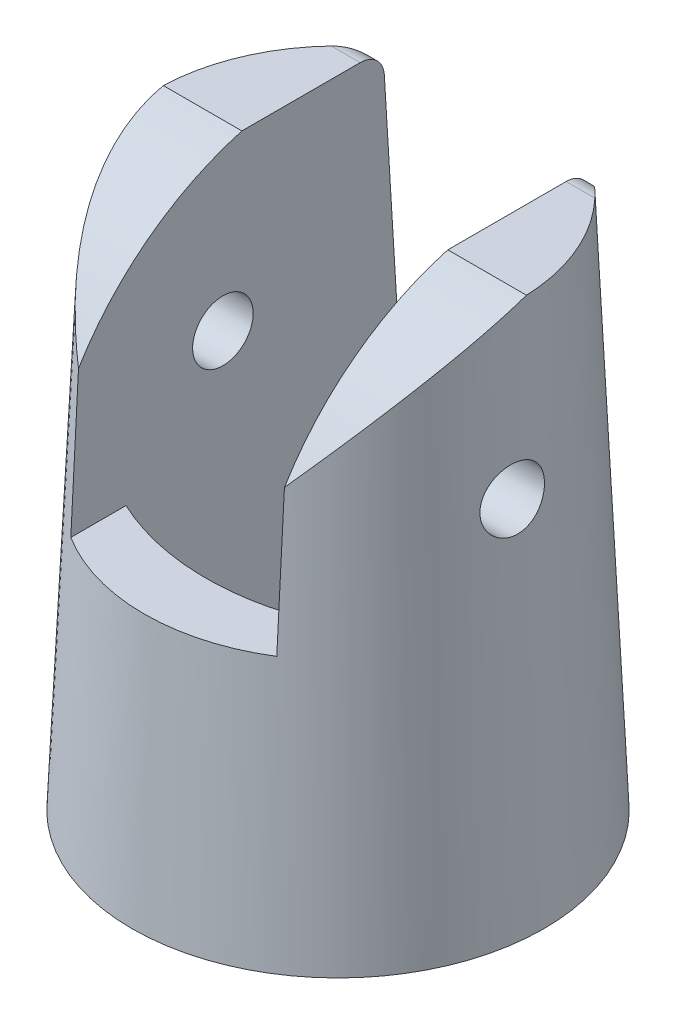
ISO-10303-21;
HEADER;
FILE_DESCRIPTION(('STEP AP214'),'2;1');
FILE_NAME('part.step','',(''),(''),'','','');
FILE_SCHEMA(('AUTOMOTIVE_DESIGN { 1 0 10303 214 1 1 1 1 }'));
ENDSEC;
DATA;
#1=APPLICATION_CONTEXT('core data for automotive mechanical design processes');
#2=APPLICATION_PROTOCOL_DEFINITION('international standard','automotive_design',2000,#1);
#3=PRODUCT_CONTEXT('',#1,'mechanical');
#4=PRODUCT('Part','Part','',(#3));
#5=PRODUCT_RELATED_PRODUCT_CATEGORY('part','',(#4));
#6=PRODUCT_DEFINITION_FORMATION('','',#4);
#7=PRODUCT_DEFINITION_CONTEXT('part definition',#1,'design');
#8=PRODUCT_DEFINITION('design','',#6,#7);
#9=PRODUCT_DEFINITION_SHAPE('','',#8);
#10=(LENGTH_UNIT() NAMED_UNIT(*) SI_UNIT(.MILLI.,.METRE.));
#11=(NAMED_UNIT(*) PLANE_ANGLE_UNIT() SI_UNIT($,.RADIAN.));
#12=(NAMED_UNIT(*) SI_UNIT($,.STERADIAN.) SOLID_ANGLE_UNIT());
#13=UNCERTAINTY_MEASURE_WITH_UNIT(LENGTH_MEASURE(1.E-05),#10,'distance_accuracy_value','');
#14=(GEOMETRIC_REPRESENTATION_CONTEXT(3) GLOBAL_UNCERTAINTY_ASSIGNED_CONTEXT((#13)) GLOBAL_UNIT_ASSIGNED_CONTEXT((#10,
#11,#12)) REPRESENTATION_CONTEXT('',''));
#15=CARTESIAN_POINT('',(0.,0.,0.));
#16=DIRECTION('',(0.,0.,1.));
#17=DIRECTION('',(1.,0.,0.));
#18=AXIS2_PLACEMENT_3D('',#15,#16,#17);
#19=CARTESIAN_POINT('',(-4.25,11.,10.));
#20=DIRECTION('',(0.,1.,0.));
#21=DIRECTION('',(0.,0.,1.));
#22=AXIS2_PLACEMENT_3D('',#19,#20,#21);
#23=PLANE('',#22);
#24=CARTESIAN_POINT('',(0.,11.,-4.55193349511584));
#25=DIRECTION('',(0.,1.,0.));
#26=DIRECTION('',(0.,0.,1.));
#27=AXIS2_PLACEMENT_3D('',#24,#25,#26);
#28=CIRCLE('',#27,10.);
#29=CARTESIAN_POINT('',(-4.25,11.,4.5));
#30=VERTEX_POINT('',#29);
#31=CARTESIAN_POINT('',(4.25,11.,4.5));
#32=VERTEX_POINT('',#31);
#33=EDGE_CURVE('E169',#30,#32,#28,.T.);
#34=ORIENTED_EDGE('',*,*,#33,.F.);
#35=DIRECTION('',(0.,0.,-1.));
#36=VECTOR('',#35,1.);
#37=CARTESIAN_POINT('',(-4.25,11.,10.));
#38=LINE('',#37,#36);
#39=CARTESIAN_POINT('',(-4.25,11.,6.77772085586298));
#40=VERTEX_POINT('',#39);
#41=EDGE_CURVE('E233',#40,#30,#38,.T.);
#42=ORIENTED_EDGE('',*,*,#41,.F.);
#43=CARTESIAN_POINT('',(0.,11.,0.));
#44=DIRECTION('',(0.,1.,0.));
#45=DIRECTION('',(0.,0.,1.));
#46=AXIS2_PLACEMENT_3D('',#43,#44,#45);
#47=CIRCLE('',#46,8.);
#48=CARTESIAN_POINT('',(4.25,11.,6.77772085586298));
#49=VERTEX_POINT('',#48);
#50=EDGE_CURVE('E342',#49,#40,#47,.F.);
#51=ORIENTED_EDGE('',*,*,#50,.F.);
#52=DIRECTION('',(0.,0.,-1.));
#53=VECTOR('',#52,1.);
#54=CARTESIAN_POINT('',(4.25,11.,10.));
#55=LINE('',#54,#53);
#56=EDGE_CURVE('E229',#49,#32,#55,.T.);
#57=ORIENTED_EDGE('',*,*,#56,.T.);
#58=EDGE_LOOP('',(#34,#42,#51,#57));
#59=FACE_BOUND('',#58,.T.);
#60=ADVANCED_FACE('F37',(#59),#23,.T.);
#61=CARTESIAN_POINT('',(0.,22.,0.));
#62=DIRECTION('',(0.,1.,0.));
#63=DIRECTION('',(0.,0.,1.));
#64=AXIS2_PLACEMENT_3D('',#61,#62,#63);
#65=PLANE('',#64);
#66=DIRECTION('',(0.,0.,-1.));
#67=VECTOR('',#66,1.);
#68=CARTESIAN_POINT('',(-4.25,22.,0.));
#69=LINE('',#68,#67);
#70=CARTESIAN_POINT('',(-4.25,22.,-0.282780766378372));
#71=VERTEX_POINT('',#70);
#72=CARTESIAN_POINT('',(-4.25,22.,-5.16422596730198));
#73=VERTEX_POINT('',#72);
#74=EDGE_CURVE('E243',#71,#73,#69,.T.);
#75=ORIENTED_EDGE('',*,*,#74,.T.);
#76=DIRECTION('',(1.,0.,0.));
#77=VECTOR('',#76,1.);
#78=CARTESIAN_POINT('',(-4.35658145321195,22.,-5.16422596730198));
#79=LINE('',#78,#77);
#80=CARTESIAN_POINT('',(-5.438821816591,22.,-5.16422557510443));
#81=VERTEX_POINT('',#80);
#82=EDGE_CURVE('E12',#73,#81,#79,.F.);
#83=ORIENTED_EDGE('',*,*,#82,.T.);
#84=CARTESIAN_POINT('',(0.,22.,0.));
#85=DIRECTION('',(0.,1.,0.));
#86=DIRECTION('',(0.,0.,1.));
#87=AXIS2_PLACEMENT_3D('',#84,#85,#86);
#88=CIRCLE('',#87,7.5);
#89=CARTESIAN_POINT('',(-7.49466710656093,22.,-0.282780766378366));
#90=VERTEX_POINT('',#89);
#91=EDGE_CURVE('E266',#81,#90,#88,.T.);
#92=ORIENTED_EDGE('',*,*,#91,.T.);
#93=DIRECTION('',(-1.,0.,0.));
#94=VECTOR('',#93,1.);
#95=CARTESIAN_POINT('',(10.,22.,-0.282780766378372));
#96=LINE('',#95,#94);
#97=EDGE_CURVE('E223',#71,#90,#96,.T.);
#98=ORIENTED_EDGE('',*,*,#97,.F.);
#99=EDGE_LOOP('',(#75,#83,#92,#98));
#100=FACE_BOUND('',#99,.T.);
#101=ADVANCED_FACE('F301',(#100),#65,.T.);
#102=CARTESIAN_POINT('',(7.49466710656093,22.,-0.282780766378372));
#103=VERTEX_POINT('',#102);
#104=CARTESIAN_POINT('',(5.43882208829554,22.,-5.16422548309984));
#105=VERTEX_POINT('',#104);
#106=EDGE_CURVE('E262',#103,#105,#88,.T.);
#107=ORIENTED_EDGE('',*,*,#106,.T.);
#108=DIRECTION('',(1.,0.,0.));
#109=VECTOR('',#108,1.);
#110=CARTESIAN_POINT('',(4.25,22.,-5.16422596730198));
#111=LINE('',#110,#109);
#112=CARTESIAN_POINT('',(4.25,22.,-5.16422596730198));
#113=VERTEX_POINT('',#112);
#114=EDGE_CURVE('E250',#105,#113,#111,.F.);
#115=ORIENTED_EDGE('',*,*,#114,.T.);
#116=DIRECTION('',(0.,0.,1.));
#117=VECTOR('',#116,1.);
#118=CARTESIAN_POINT('',(4.25,22.,0.));
#119=LINE('',#118,#117);
#120=CARTESIAN_POINT('',(4.25,22.,-0.282780766378372));
#121=VERTEX_POINT('',#120);
#122=EDGE_CURVE('E235',#113,#121,#119,.T.);
#123=ORIENTED_EDGE('',*,*,#122,.T.);
#124=DIRECTION('',(-1.,0.,0.));
#125=VECTOR('',#124,1.);
#126=CARTESIAN_POINT('',(10.,22.,-0.282780766378372));
#127=LINE('',#126,#125);
#128=EDGE_CURVE('E185',#103,#121,#127,.T.);
#129=ORIENTED_EDGE('',*,*,#128,.F.);
#130=EDGE_LOOP('',(#107,#115,#123,#129));
#131=FACE_BOUND('',#130,.T.);
#132=ADVANCED_FACE('F307',(#131),#65,.T.);
#133=CARTESIAN_POINT('',(0.,22.,0.));
#134=DIRECTION('',(0.,-1.,0.));
#135=DIRECTION('',(0.,0.,-1.));
#136=AXIS2_PLACEMENT_3D('',#133,#134,#135);
#137=CONICAL_SURFACE('',#136,7.5,0.0454232794215771);
#138=CARTESIAN_POINT('',(-7.83796735688722,14.3622174893562,-0.379967166316532));
#139=CARTESIAN_POINT('',(-7.84258137245685,14.3133454888,-0.330657672658891));
#140=CARTESIAN_POINT('',(-7.84674066486493,14.2685433740009,-0.277221256144542));
#141=CARTESIAN_POINT('',(-7.8535770197042,14.1883770300518,-0.163551374229644));
#142=CARTESIAN_POINT('',(-7.85625291943775,14.1530202154338,-0.103312621478253));
#143=CARTESIAN_POINT('',(-7.8596375423327,14.0927931436459,0.0222748852102719));
#144=CARTESIAN_POINT('',(-7.86034581452373,14.067925291601,0.0876248070735893));
#145=CARTESIAN_POINT('',(-7.85946228431654,14.0294247957157,0.221525428298117));
#146=CARTESIAN_POINT('',(-7.85787100492778,14.0157895982304,0.290075396410406));
#147=CARTESIAN_POINT('',(-7.85228410719661,14.0001840444117,0.427766064798726));
#148=CARTESIAN_POINT('',(-7.84831020572619,13.99811004868,0.49689593421015));
#149=CARTESIAN_POINT('',(-7.83806545214515,14.0053392217948,0.634384128941271));
#150=CARTESIAN_POINT('',(-7.83179450336468,14.014642869501,0.702742421664805));
#151=CARTESIAN_POINT('',(-7.81722601313375,14.0443276298967,0.837049248229593));
#152=CARTESIAN_POINT('',(-7.80892100022893,14.0647499293699,0.902987843329573));
#153=CARTESIAN_POINT('',(-7.790775888944,14.1160446525726,1.03043929857791));
#154=CARTESIAN_POINT('',(-7.78093560413196,14.1469183459746,1.09195161990537));
#155=CARTESIAN_POINT('',(-7.76010966108363,14.2190054175936,1.21024682770151));
#156=CARTESIAN_POINT('',(-7.74910385329152,14.2604277357386,1.26689885331061));
#157=CARTESIAN_POINT('',(-7.72687097524336,14.3521248730564,1.37247369304183));
#158=CARTESIAN_POINT('',(-7.71564387723455,14.4024008089463,1.42139553066781));
#159=CARTESIAN_POINT('',(-7.69356264148555,14.5114011926656,1.51095465792816));
#160=CARTESIAN_POINT('',(-7.68271790805299,14.5702531136188,1.55143935878097));
#161=CARTESIAN_POINT('',(-7.6623986074272,14.6941689491704,1.62188693084612));
#162=CARTESIAN_POINT('',(-7.65292397084745,14.7592325489103,1.65185033500368));
#163=CARTESIAN_POINT('',(-7.63612434840078,14.8931135922155,1.70006025493109));
#164=CARTESIAN_POINT('',(-7.628779504597,14.9618887622122,1.71841702637262));
#165=CARTESIAN_POINT('',(-7.61663038843077,15.1017712667087,1.74320996212474));
#166=CARTESIAN_POINT('',(-7.61182564575986,15.1728781668894,1.74964833372071));
#167=CARTESIAN_POINT('',(-7.60511802104365,15.3134015003158,1.75031471224994));
#168=CARTESIAN_POINT('',(-7.60314193334666,15.3828130458677,1.74486034008846));
#169=CARTESIAN_POINT('',(-7.60185272747497,15.5197905645542,1.72250877153392));
#170=CARTESIAN_POINT('',(-7.60253942022953,15.5873566683814,1.70561238765126));
#171=CARTESIAN_POINT('',(-7.60630351713635,15.7179091624343,1.66114648990012));
#172=CARTESIAN_POINT('',(-7.60935259794971,15.7809402068652,1.63370535133399));
#173=CARTESIAN_POINT('',(-7.61736988938797,15.9015696424095,1.5689454281796));
#174=CARTESIAN_POINT('',(-7.62233823791652,15.9591676427765,1.53162593387021));
#175=CARTESIAN_POINT('',(-7.63370221314921,16.0681355426512,1.44760265700419));
#176=CARTESIAN_POINT('',(-7.64011600940821,16.1194120265777,1.40078023978353));
#177=CARTESIAN_POINT('',(-7.65367838854403,16.2134837982302,1.29936472333884));
#178=CARTESIAN_POINT('',(-7.66082704856748,16.2562781941154,1.24477080802427));
#179=CARTESIAN_POINT('',(-7.67534091282203,16.3329515652811,1.12822611342176));
#180=CARTESIAN_POINT('',(-7.68270769514751,16.3666553047501,1.06616013918209));
#181=CARTESIAN_POINT('',(-7.69691604657131,16.423165976049,0.937193488415527));
#182=CARTESIAN_POINT('',(-7.70375760872745,16.4459727638678,0.870292748007195));
#183=CARTESIAN_POINT('',(-7.71644262030627,16.4800561197651,0.733349431588449));
#184=CARTESIAN_POINT('',(-7.72228364732094,16.4913050247458,0.663299734651517));
#185=CARTESIAN_POINT('',(-7.73262752673949,16.5018027282445,0.52220965075789));
#186=CARTESIAN_POINT('',(-7.73713045599583,16.5010522160741,0.45116932094277));
#187=CARTESIAN_POINT('',(-7.74464533464226,16.4875918161016,0.310815334039046));
#188=CARTESIAN_POINT('',(-7.74767065771755,16.4749923395032,0.241491793203629));
#189=CARTESIAN_POINT('',(-7.7523770032345,16.4383254425338,0.105900144542275));
#190=CARTESIAN_POINT('',(-7.75405805542838,16.4142582759914,0.0396319691237607));
#191=CARTESIAN_POINT('',(-7.75633448543182,16.3554710465647,-0.0876438503397986));
#192=CARTESIAN_POINT('',(-7.75693482435448,16.3208005225005,-0.148674301814936));
#193=CARTESIAN_POINT('',(-7.75745954559994,16.2417479395246,-0.264086768502954));
#194=CARTESIAN_POINT('',(-7.75738391180716,16.1973656491035,-0.318468625178238));
#195=CARTESIAN_POINT('',(-7.75702698900383,16.0999847315327,-0.419211339047034));
#196=CARTESIAN_POINT('',(-7.75674504948525,16.0469592633596,-0.46554625006309));
#197=CARTESIAN_POINT('',(-7.75646152768906,15.9338912875551,-0.54867361029364));
#198=CARTESIAN_POINT('',(-7.75645994636058,15.873848756169,-0.585466027202549));
#199=CARTESIAN_POINT('',(-7.75716824579797,15.7483571213731,-0.648511138791822));
#200=CARTESIAN_POINT('',(-7.75787915678735,15.6829003149688,-0.674748494466434));
#201=CARTESIAN_POINT('',(-7.76032771935512,15.5485315888061,-0.715859664595586));
#202=CARTESIAN_POINT('',(-7.76206531536022,15.4796198562436,-0.730734094012506));
#203=CARTESIAN_POINT('',(-7.76670676584568,15.3405207125202,-0.748683187532379));
#204=CARTESIAN_POINT('',(-7.76960720822943,15.2703376022251,-0.751792098543693));
#205=CARTESIAN_POINT('',(-7.77652868962862,15.130481192041,-0.746239744423889));
#206=CARTESIAN_POINT('',(-7.78054994377231,15.0608079926616,-0.737576218456635));
#207=CARTESIAN_POINT('',(-7.78948146542229,14.9238460238463,-0.708730903239069));
#208=CARTESIAN_POINT('',(-7.79439304167692,14.8565609413452,-0.688532062131407));
#209=CARTESIAN_POINT('',(-7.80469362494343,14.7263866758636,-0.637196842199326));
#210=CARTESIAN_POINT('',(-7.8100822334847,14.6634939010552,-0.606069528773816));
#211=CARTESIAN_POINT('',(-7.8193813436165,14.5597286320879,-0.543391023811534));
#212=CARTESIAN_POINT('',(-7.82330433193733,14.5174439551711,-0.514147846605544));
#213=CARTESIAN_POINT('',(-7.83089031896814,14.4367692624713,-0.450678665707522));
#214=CARTESIAN_POINT('',(-7.83455331694851,14.3983792576176,-0.416452648032942));
#215=CARTESIAN_POINT('',(-7.83796735688722,14.3622174893562,-0.379967166316532));
#216=B_SPLINE_CURVE_WITH_KNOTS('',3,(#138,#139,#140,#141,#142,#143,#144,#145,#146,#147,#148,
#149,#150,#151,#152,#153,#154,#155,#156,#157,#158,#159,#160,#161,#162,#163,#164,#165,#166,#167,
#168,#169,#170,#171,#172,#173,#174,#175,#176,#177,#178,#179,#180,#181,#182,#183,#184,#185,#186,
#187,#188,#189,#190,#191,#192,#193,#194,#195,#196,#197,#198,#199,#200,#201,#202,#203,#204,#205,
#206,#207,#208,#209,#210,#211,#212,#213,#214,#215),.UNSPECIFIED.,.T.,.F.,(4,2,2,2,2,2,2,2,2,2,2,
2,2,2,2,2,2,2,2,2,2,2,2,2,2,2,2,2,2,2,2,2,2,2,2,2,2,2,4),(0.,0.208553037536983,
0.417269310681504,0.626033416602673,0.834750048737337,1.04159261254212,1.24844388219199,
1.45606665596537,1.66371466154781,1.87584802928522,2.08800817283942,2.30372407188203,
2.5194290424861,2.73305288682505,2.94663716410913,3.1545872325207,3.36252253570734,
3.5680027052275,3.77349764170111,3.98173607251478,4.18999638674758,4.40202316410761,
4.61405274347572,4.82658862900881,5.03911230536931,5.24967505863844,5.46023315147818,
5.66982216909493,5.87941618344591,6.08967393764611,6.29993240365297,6.51049533073528,
6.72104686132943,6.9309850479449,7.14096355781078,7.3512532707934,7.56136895456364,
7.7156827817969,7.86999704206467),.UNSPECIFIED.);
#217=CARTESIAN_POINT('',(-7.83796735688722,14.3622174893562,-0.379967166316532));
#218=VERTEX_POINT('',#217);
#219=EDGE_CURVE('E513',#218,#218,#216,.T.);
#220=ORIENTED_EDGE('',*,*,#219,.F.);
#221=EDGE_LOOP('',(#220));
#222=FACE_BOUND('',#221,.T.);
#223=CARTESIAN_POINT('',(7.83796735688722,14.3622174893562,-0.379967166316532));
#224=CARTESIAN_POINT('',(7.83328744997076,14.411786493911,-0.429972551895006));
#225=CARTESIAN_POINT('',(7.82813491145327,14.4655970435523,-0.475788374346393));
#226=CARTESIAN_POINT('',(7.81750342359286,14.5801753249335,-0.557736154925302));
#227=CARTESIAN_POINT('',(7.81202413824418,14.6409502797276,-0.593857926863398));
#228=CARTESIAN_POINT('',(7.80132350845169,14.7677115943127,-0.655359958784005));
#229=CARTESIAN_POINT('',(7.79610206849342,14.8336960004513,-0.680744223061779));
#230=CARTESIAN_POINT('',(7.78639291034306,14.9690294601727,-0.720049024368095));
#231=CARTESIAN_POINT('',(7.78190500745661,15.0383776610788,-0.733972450649714));
#232=CARTESIAN_POINT('',(7.77399091836468,15.1783689326216,-0.749929222930623));
#233=CARTESIAN_POINT('',(7.77056291818221,15.2490095693085,-0.751982991142016));
#234=CARTESIAN_POINT('',(7.76489197262362,15.3896780692755,-0.744167192422135));
#235=CARTESIAN_POINT('',(7.76264903265032,15.4597059297606,-0.734297571131351));
#236=CARTESIAN_POINT('',(7.75929248978818,15.5967220156707,-0.702993570327685));
#237=CARTESIAN_POINT('',(7.75817236040506,15.6637256196513,-0.681627146744599));
#238=CARTESIAN_POINT('',(7.75679365361985,15.7932173640281,-0.627974577793198));
#239=CARTESIAN_POINT('',(7.75653508331722,15.8557054672114,-0.595688342445601));
#240=CARTESIAN_POINT('',(7.75649444526569,15.9744166240331,-0.521095827758258));
#241=CARTESIAN_POINT('',(7.7567125622039,16.030637240535,-0.478785670425268));
#242=CARTESIAN_POINT('',(7.75715624655791,16.1351989223126,-0.385346803019363));
#243=CARTESIAN_POINT('',(7.75738181406936,16.1835398863793,-0.334217979693817));
#244=CARTESIAN_POINT('',(7.75735277244982,16.2710823014537,-0.224452008036309));
#245=CARTESIAN_POINT('',(7.75709699967637,16.31026134601,-0.165796984553424));
#246=CARTESIAN_POINT('',(7.75566157635508,16.3782114671868,-0.0427503856031548));
#247=CARTESIAN_POINT('',(7.75448195024235,16.406982819052,0.0216410381015864));
#248=CARTESIAN_POINT('',(7.75087513937824,16.4532417161059,0.154138010703875));
#249=CARTESIAN_POINT('',(7.74845117341741,16.4707581130484,0.222233573597005));
#250=CARTESIAN_POINT('',(7.74219359590397,16.4941450998807,0.360331220773842));
#251=CARTESIAN_POINT('',(7.73836001268759,16.5000159238554,0.430333266707115));
#252=CARTESIAN_POINT('',(7.72932068479677,16.4999840438097,0.570093595387188));
#253=CARTESIAN_POINT('',(7.72411787249586,16.4941063254208,0.639852080057964));
#254=CARTESIAN_POINT('',(7.71255950790742,16.4708408417027,0.77732349852629));
#255=CARTESIAN_POINT('',(7.70620390189043,16.4534525397877,0.84503633680861));
#256=CARTESIAN_POINT('',(7.69269658051719,16.4075370442686,0.976990666341746));
#257=CARTESIAN_POINT('',(7.68553992325761,16.3789376360297,1.04120651486163));
#258=CARTESIAN_POINT('',(7.67101803808324,16.3114123472423,1.16393536511896));
#259=CARTESIAN_POINT('',(7.66365279507404,16.2724857176454,1.22244795276948));
#260=CARTESIAN_POINT('',(7.64930430545073,16.1849979103186,1.33262702154622));
#261=CARTESIAN_POINT('',(7.64232472712915,16.1363596199086,1.38423279897497));
#262=CARTESIAN_POINT('',(7.62951784340339,16.0309808458313,1.47855429872189));
#263=CARTESIAN_POINT('',(7.62369050222643,15.9742406137942,1.52127029703761));
#264=CARTESIAN_POINT('',(7.61388677149647,15.8546071582144,1.59631412815498));
#265=CARTESIAN_POINT('',(7.60989910971896,15.7917543426828,1.62870483824421));
#266=CARTESIAN_POINT('',(7.60426405732497,15.6614026873648,1.68246189666889));
#267=CARTESIAN_POINT('',(7.60261632102336,15.5939045353947,1.70382987313305));
#268=CARTESIAN_POINT('',(7.60201413428632,15.4576064065578,1.73457894238311));
#269=CARTESIAN_POINT('',(7.60300775882109,15.3888575301053,1.74418579213573));
#270=CARTESIAN_POINT('',(7.60767099089208,15.2508115759145,1.75190966695364));
#271=CARTESIAN_POINT('',(7.61134043696361,15.1815145315033,1.75002738524674));
#272=CARTESIAN_POINT('',(7.62115557547188,15.0449328497942,1.73496140239145));
#273=CARTESIAN_POINT('',(7.62728047676171,14.9776362883151,1.72187156798986));
#274=CARTESIAN_POINT('',(7.6416294406344,14.8462855334842,1.68497664018864));
#275=CARTESIAN_POINT('',(7.64985369677373,14.7822316397532,1.66117055861715));
#276=CARTESIAN_POINT('',(7.66801243401358,14.6579498642628,1.6030701895091));
#277=CARTESIAN_POINT('',(7.6779742216434,14.5978081122334,1.56860035291659));
#278=CARTESIAN_POINT('',(7.69881665045785,14.4841316963163,1.49030840998256));
#279=CARTESIAN_POINT('',(7.70969743522397,14.4305980680908,1.44648484060131));
#280=CARTESIAN_POINT('',(7.73191396506617,14.3302369345709,1.34942943943223));
#281=CARTESIAN_POINT('',(7.74325425905537,14.2836130542963,1.29598786361171));
#282=CARTESIAN_POINT('',(7.76532822275802,14.200004007431,1.18191600547704));
#283=CARTESIAN_POINT('',(7.77606186415307,14.1630192905038,1.12128538798862));
#284=CARTESIAN_POINT('',(7.79623886870943,14.0996284747101,0.994176429544855));
#285=CARTESIAN_POINT('',(7.80567632874684,14.073269780279,0.927673462984204));
#286=CARTESIAN_POINT('',(7.82259046158376,14.0322318910173,0.790920827608196));
#287=CARTESIAN_POINT('',(7.83006744861704,14.017550823674,0.720671761410059));
#288=CARTESIAN_POINT('',(7.84250930031314,14.0005847034211,0.579912298187302));
#289=CARTESIAN_POINT('',(7.84752147606881,13.9980572854591,0.509435309955935));
#290=CARTESIAN_POINT('',(7.85506980203676,14.0049041647396,0.368915684328601));
#291=CARTESIAN_POINT('',(7.85760577766391,14.0142793010676,0.298873077904732));
#292=CARTESIAN_POINT('',(7.86022591507369,14.0444071543172,0.16261990560353));
#293=CARTESIAN_POINT('',(7.86035508572819,14.0649435994135,0.0963621497411571));
#294=CARTESIAN_POINT('',(7.85853055532961,14.1166536842147,-0.0317812303583417));
#295=CARTESIAN_POINT('',(7.85657877647283,14.1478174892377,-0.0936708332500995));
#296=CARTESIAN_POINT('',(7.85185318686241,14.2090525709101,-0.193735923866123));
#297=CARTESIAN_POINT('',(7.84950029916606,14.2366587523309,-0.233464626389799));
#298=CARTESIAN_POINT('',(7.844161430126,14.2962513658329,-0.309440878422374));
#299=CARTESIAN_POINT('',(7.84117544129214,14.3282378497355,-0.34568838673822));
#300=CARTESIAN_POINT('',(7.83796735688722,14.3622174893562,-0.379967166316532));
#301=B_SPLINE_CURVE_WITH_KNOTS('',3,(#223,#224,#225,#226,#227,#228,#229,#230,#231,#232,#233,
#234,#235,#236,#237,#238,#239,#240,#241,#242,#243,#244,#245,#246,#247,#248,#249,#250,#251,#252,
#253,#254,#255,#256,#257,#258,#259,#260,#261,#262,#263,#264,#265,#266,#267,#268,#269,#270,#271,
#272,#273,#274,#275,#276,#277,#278,#279,#280,#281,#282,#283,#284,#285,#286,#287,#288,#289,#290,
#291,#292,#293,#294,#295,#296,#297,#298,#299,#300),.UNSPECIFIED.,.T.,.F.,(4,2,2,2,2,2,2,2,2,2,2,
2,2,2,2,2,2,2,2,2,2,2,2,2,2,2,2,2,2,2,2,2,2,2,2,2,2,2,4),(0.,0.211521205247813,
0.423263807442014,0.634927375558794,0.846537567380178,1.0577835669305,1.26903052956875,
1.47904234258002,1.68905588613143,1.89915081148957,2.10924843516682,2.31985462343067,
2.53045524153484,2.74051381413051,2.95056816434615,3.16017626716105,3.36979414190905,
3.58078503094666,3.79179122764584,4.00454472861511,4.2172916233229,4.4287170558575,
4.6401112505464,4.84738064458982,5.05463753259738,5.26017537178874,5.46573216802022,
5.67487122393724,5.8840430157978,6.09850004920052,6.31296708515514,6.52838057854262,
6.74375952331146,6.95482510378299,7.16590556441396,7.37303463285966,7.57997253949852,
7.72496898140106,7.86996713883852),.UNSPECIFIED.);
#302=CARTESIAN_POINT('',(7.83796735688722,14.3622174893562,-0.379967166316532));
#303=VERTEX_POINT('',#302);
#304=EDGE_CURVE('E507',#303,#303,#301,.T.);
#305=ORIENTED_EDGE('',*,*,#304,.F.);
#306=EDGE_LOOP('',(#305));
#307=FACE_BOUND('',#306,.T.);
#308=CARTESIAN_POINT('',(0.,41.3966504623758,-4.91858206978573));
#309=DIRECTION('',(0.,-0.061048539534854,0.998134798421867));
#310=DIRECTION('',(0.,-0.998134798421867,-0.061048539534854));
#311=AXIS2_PLACEMENT_3D('',#308,#309,#310);
#312=ELLIPSE('',#311,108.411013929554,4.42830625448101);
#313=CARTESIAN_POINT('',(4.34940519150883,21.0610485395348,-6.16236076572385));
#314=VERTEX_POINT('',#313);
#315=CARTESIAN_POINT('',(4.25,11.,-6.77772085586298));
#316=VERTEX_POINT('',#315);
#317=EDGE_CURVE('E171',#314,#316,#312,.F.);
#318=ORIENTED_EDGE('',*,*,#317,.F.);
#319=CARTESIAN_POINT('',(4.34940519150883,21.0610485395349,-6.16236076572385));
#320=CARTESIAN_POINT('',(4.34960668817625,21.0960037714882,-6.16026639709529));
#321=CARTESIAN_POINT('',(4.35255770840583,21.1307027635223,-6.15626033932825));
#322=CARTESIAN_POINT('',(4.36323729220071,21.1984264149009,-6.14492437754313));
#323=CARTESIAN_POINT('',(4.37091464928772,21.2314649684895,-6.13763032047632));
#324=CARTESIAN_POINT('',(4.3927674187493,21.3034159998716,-6.11798905969393));
#325=CARTESIAN_POINT('',(4.40808163224176,21.3417552703831,-6.10483757135849));
#326=CARTESIAN_POINT('',(4.44349099131189,21.4147941627066,-6.07500114310349));
#327=CARTESIAN_POINT('',(4.46360781026385,21.4494762264571,-6.05830022381533));
#328=CARTESIAN_POINT('',(4.51834985809759,21.5317973235916,-6.01298583576456));
#329=CARTESIAN_POINT('',(4.55514250711387,21.5770255303745,-5.98264043640866));
#330=CARTESIAN_POINT('',(4.63324615227983,21.6597061595097,-5.91759225288077));
#331=CARTESIAN_POINT('',(4.67456645627655,21.6971420868919,-5.8828804698848));
#332=CARTESIAN_POINT('',(4.78221980236055,21.7828896509989,-5.79100629877273));
#333=CARTESIAN_POINT('',(4.8503074683537,21.8266110984243,-5.73161575598004));
#334=CARTESIAN_POINT('',(4.98881469902542,21.8995032525744,-5.60704864762353));
#335=CARTESIAN_POINT('',(5.05923576587386,21.9286643838315,-5.54186830754522));
#336=CARTESIAN_POINT('',(5.18172123590552,21.9668930634414,-5.4247129010371));
#337=CARTESIAN_POINT('',(5.23375859656191,21.9792240430582,-5.37375512147988));
#338=CARTESIAN_POINT('',(5.33701405608624,21.9957402272397,-5.27015891537571));
#339=CARTESIAN_POINT('',(5.38823463353786,21.9999585068014,-5.21752820599083));
#340=CARTESIAN_POINT('',(5.43882157834542,21.9999999999995,-5.16422499886717));
#341=B_SPLINE_CURVE_WITH_KNOTS('',3,(#319,#320,#321,#322,#323,#324,#325,#326,#327,#328,#329,
#330,#331,#332,#333,#334,#335,#336,#337,#338,#339,#340),.UNSPECIFIED.,.F.,.F.,(4,2,2,2,2,2,2,2,
2,2,4),(0.,0.104713635229163,0.208312266464569,0.337583019397058,0.467448560866493,
0.663534383733636,0.860031158880604,1.15956187798788,1.45928932231263,1.6804477134348,
1.9007025274968),.UNSPECIFIED.);
#342=EDGE_CURVE('E253',#314,#105,#341,.T.);
#343=ORIENTED_EDGE('',*,*,#342,.T.);
#344=ORIENTED_EDGE('',*,*,#106,.F.);
#345=CARTESIAN_POINT('',(3.92629643649929,16.4998,6.68182888151938));
#346=CARTESIAN_POINT('',(4.01931564514,16.6087596912144,6.62142155513562));
#347=CARTESIAN_POINT('',(4.11131934328455,16.7173930395185,6.55888032044954));
#348=CARTESIAN_POINT('',(4.2932260178552,16.9338412713703,6.42945464521689));
#349=CARTESIAN_POINT('',(4.38312886202439,17.0416561031024,6.36256993222782));
#350=CARTESIAN_POINT('',(4.64974442688335,17.3638214077866,6.15515905521457));
#351=CARTESIAN_POINT('',(4.82317510446661,17.5766708748424,6.00799843905382));
#352=CARTESIAN_POINT('',(5.16169686386746,17.9988471466584,5.69400575303419));
#353=CARTESIAN_POINT('',(5.32669369672939,18.208121685456,5.52700099956619));
#354=CARTESIAN_POINT('',(5.64481535638337,18.6193198754499,5.17407572809778));
#355=CARTESIAN_POINT('',(5.79794544197142,18.8212467614988,4.98816367438537));
#356=CARTESIAN_POINT('',(6.18554186312356,19.344583308023,4.46948304084846));
#357=CARTESIAN_POINT('',(6.40828324022354,19.6584689169281,4.11972189091382));
#358=CARTESIAN_POINT('',(6.70460657922282,20.1030052689049,3.55584345351292));
#359=CARTESIAN_POINT('',(6.79701231639435,20.2466767825226,3.36154965453657));
#360=CARTESIAN_POINT('',(6.96755426977346,20.5240954336224,2.95998057341705));
#361=CARTESIAN_POINT('',(7.04569416904946,20.6578451273514,2.7527086604966));
#362=CARTESIAN_POINT('',(7.17256638181405,20.8899099716306,2.36580838957839));
#363=CARTESIAN_POINT('',(7.22406541289287,20.9901763018322,2.18825189066998));
#364=CARTESIAN_POINT('',(7.31510853322135,21.1822314807992,1.82566056472446));
#365=CARTESIAN_POINT('',(7.35465549431912,21.2740223623616,1.64062754628174));
#366=CARTESIAN_POINT('',(7.42056862050664,21.4481005988231,1.26431410365367));
#367=CARTESIAN_POINT('',(7.44696120414356,21.5304067445339,1.0730470299074));
#368=CARTESIAN_POINT('',(7.48555616887137,21.6848871796944,0.68514833352627));
#369=CARTESIAN_POINT('',(7.49776772335813,21.757067992397,0.48852026316183));
#370=CARTESIAN_POINT('',(7.50462208608418,21.8557629190509,0.195068954102029));
#371=CARTESIAN_POINT('',(7.50510898755003,21.8864428593324,0.0997400677496214));
#372=CARTESIAN_POINT('',(7.50253793378852,21.9452762371562,-0.0915936069798442));
#373=CARTESIAN_POINT('',(7.49948176524655,21.9734309404044,-0.187598030443378));
#374=CARTESIAN_POINT('',(7.49461138166237,22.0003080623876,-0.28388412339532));
#375=B_SPLINE_CURVE_WITH_KNOTS('',3,(#345,#346,#347,#348,#349,#350,#351,#352,#353,#354,#355,
#356,#357,#358,#359,#360,#361,#362,#363,#364,#365,#366,#367,#368,#369,#370,#371,#372,#373,#374),
.UNSPECIFIED.,.F.,.F.,(4,2,2,2,2,2,2,2,2,2,2,2,2,2,4),(0.,0.466403210186573,0.932835703589585,
1.86664716605778,2.8092792869606,3.75149125909967,5.30530822586806,6.08073041777247,
6.85595213185147,7.48631450141871,8.11652528662495,8.74546523819607,9.37399811531518,
9.67435061674296,9.97455172345294),.UNSPECIFIED.);
#376=CARTESIAN_POINT('',(4.25,16.8824851749416,6.45993994327909));
#377=VERTEX_POINT('',#376);
#378=EDGE_CURVE('E183',#377,#103,#375,.T.);
#379=ORIENTED_EDGE('',*,*,#378,.F.);
#380=CARTESIAN_POINT('',(4.24999999999999,28.8057765116834,5.80024977110232));
#381=CARTESIAN_POINT('',(4.24999999999999,26.2989672472569,5.9414803133123));
#382=CARTESIAN_POINT('',(4.25,23.7920608816099,6.08097461329277));
#383=CARTESIAN_POINT('',(4.25,18.7780890989142,6.35703244550604));
#384=CARTESIAN_POINT('',(4.25,16.2710236820206,6.49359598055445));
#385=CARTESIAN_POINT('',(4.25,11.2567649375485,6.76433422535382));
#386=CARTESIAN_POINT('',(4.25,8.74957161001142,6.89850893587335));
#387=CARTESIAN_POINT('',(4.25,3.73507492544163,7.16483292436775));
#388=CARTESIAN_POINT('',(4.25,1.22777156830585,7.29698220040266));
#389=CARTESIAN_POINT('',(4.25,-1.27957505847372,7.42830030504297));
#390=B_SPLINE_CURVE_WITH_KNOTS('',3,(#380,#381,#382,#383,#384,#385,#386,#387,#388,#389),
.UNSPECIFIED.,.F.,.F.,(4,2,2,2,4),(0.,7.5323518408429,15.0646964449593,22.5970386255993,
30.129388020287),.UNSPECIFIED.);
#391=EDGE_CURVE('E347',#377,#49,#390,.T.);
#392=ORIENTED_EDGE('',*,*,#391,.T.);
#393=ORIENTED_EDGE('',*,*,#50,.T.);
#394=CARTESIAN_POINT('',(-4.25,-1.27957505847371,7.42830030504297));
#395=CARTESIAN_POINT('',(-4.25,1.22777156830585,7.29698220040253));
#396=CARTESIAN_POINT('',(-4.25,3.73507492544163,7.16483292436767));
#397=CARTESIAN_POINT('',(-4.25,8.74957161001142,6.89850893587343));
#398=CARTESIAN_POINT('',(-4.25,11.2567649375485,6.764334225354));
#399=CARTESIAN_POINT('',(-4.25,16.2710236820206,6.49359598055463));
#400=CARTESIAN_POINT('',(-4.25,18.7780890989142,6.35703244550611));
#401=CARTESIAN_POINT('',(-4.25,23.7920608816099,6.08097461329268));
#402=CARTESIAN_POINT('',(-4.25000000000001,26.2989672472569,5.94148031331217));
#403=CARTESIAN_POINT('',(-4.25,28.8057765116834,5.80024977110231));
#404=B_SPLINE_CURVE_WITH_KNOTS('',3,(#394,#395,#396,#397,#398,#399,#400,#401,#402,#403),
.UNSPECIFIED.,.F.,.F.,(4,2,2,2,4),(0.,7.53234939468772,15.0646915753277,22.5970361794441,
30.129388020287),.UNSPECIFIED.);
#405=CARTESIAN_POINT('',(-4.25,16.8824851749416,6.45993994327909));
#406=VERTEX_POINT('',#405);
#407=EDGE_CURVE('E340',#40,#406,#404,.T.);
#408=ORIENTED_EDGE('',*,*,#407,.T.);
#409=CARTESIAN_POINT('',(-7.49461138166237,22.0003080623876,-0.28388412339532));
#410=CARTESIAN_POINT('',(-7.49988309951068,21.9712190846278,-0.179671951668641));
#411=CARTESIAN_POINT('',(-7.50302890185525,21.9406327300934,-0.0757903670246975));
#412=CARTESIAN_POINT('',(-7.50517997220749,21.876530339592,0.13109451540663));
#413=CARTESIAN_POINT('',(-7.50418576359576,21.8430146744732,0.234097922563612));
#414=CARTESIAN_POINT('',(-7.49516957751024,21.7382570709262,0.54121921764491));
#415=CARTESIAN_POINT('',(-7.48112808840113,21.6627231332624,0.743739635876401));
#416=CARTESIAN_POINT('',(-7.43828077256935,21.5017611807683,1.14094177768584));
#417=CARTESIAN_POINT('',(-7.40961241381115,21.4164309208909,1.33567859826578));
#418=CARTESIAN_POINT('',(-7.33878245591829,21.2361607157852,1.71816731631631));
#419=CARTESIAN_POINT('',(-7.29661717605367,21.1412181540315,1.90591729280399));
#420=CARTESIAN_POINT('',(-7.20026737266868,20.9431335214884,2.27261940341223));
#421=CARTESIAN_POINT('',(-7.1461407509817,20.8400324372421,2.45160901155736));
#422=CARTESIAN_POINT('',(-7.02698361077534,20.6261840787999,2.80110168903546));
#423=CARTESIAN_POINT('',(-6.96195399000715,20.5154374345796,2.97160545559348));
#424=CARTESIAN_POINT('',(-6.75179546283551,20.1723044580087,3.47084807264812));
#425=CARTESIAN_POINT('',(-6.59184775246264,19.9295259920633,3.78640217377691));
#426=CARTESIAN_POINT('',(-6.27814664729068,19.476767736348,4.31768661392711));
#427=CARTESIAN_POINT('',(-6.13025157024551,19.2707265163302,4.54040677859332));
#428=CARTESIAN_POINT('',(-5.81823735113368,18.8479886062566,4.96354041807549));
#429=CARTESIAN_POINT('',(-5.65410913328027,18.6312859899342,5.16394127976161));
#430=CARTESIAN_POINT('',(-5.31234904088311,18.1896276284259,5.54273628503243));
#431=CARTESIAN_POINT('',(-5.13471803279778,17.9646724132781,5.72113183874884));
#432=CARTESIAN_POINT('',(-4.76799729772391,17.5085184045354,6.05655537735724));
#433=CARTESIAN_POINT('',(-4.57891334851169,17.2773227911971,6.21359400873509));
#434=CARTESIAN_POINT('',(-4.30977503143093,16.9537346128282,6.41700145308093));
#435=CARTESIAN_POINT('',(-4.23399982905615,16.8632054471757,6.47215899836824));
#436=CARTESIAN_POINT('',(-4.08115145722696,16.6817932779821,6.57931295355229));
#437=CARTESIAN_POINT('',(-4.00408158775142,16.5909115269953,6.63131618955329));
#438=CARTESIAN_POINT('',(-3.92629643649941,16.4997999999999,6.68182888151944));
#439=B_SPLINE_CURVE_WITH_KNOTS('',3,(#409,#410,#411,#412,#413,#414,#415,#416,#417,#418,#419,
#420,#421,#422,#423,#424,#425,#426,#427,#428,#429,#430,#431,#432,#433,#434,#435,#436,#437,#438),
.UNSPECIFIED.,.F.,.F.,(4,2,2,2,2,2,2,2,2,2,2,2,2,2,4),(0.,0.324904791494705,0.649768509741711,
1.29859079449086,1.94142458372872,2.58443382900467,3.22439607689719,3.8643056562566,
5.14731722375654,6.15868823098563,7.17062791680593,8.18250272235386,9.19387124187545,
9.58475718585292,9.97476460463198),.UNSPECIFIED.);
#440=EDGE_CURVE('E221',#90,#406,#439,.T.);
#441=ORIENTED_EDGE('',*,*,#440,.F.);
#442=ORIENTED_EDGE('',*,*,#91,.F.);
#443=CARTESIAN_POINT('',(-5.43882140354224,21.9999999999997,-5.16422518296511));
#444=CARTESIAN_POINT('',(-5.40122433759026,21.999988003325,-5.20383005545125));
#445=CARTESIAN_POINT('',(-5.363273983719,21.9976475021436,-5.24307901185124));
#446=CARTESIAN_POINT('',(-5.28693546590571,21.9884676916384,-5.32063117425542));
#447=CARTESIAN_POINT('',(-5.24854721730837,21.9816274974216,-5.35893419269737));
#448=CARTESIAN_POINT('',(-5.17127647154873,21.9635269369551,-5.43467828088518));
#449=CARTESIAN_POINT('',(-5.13239260596844,21.9522280107373,-5.47210873056732));
#450=CARTESIAN_POINT('',(-5.05479542039122,21.9252776384547,-5.54552571918466));
#451=CARTESIAN_POINT('',(-5.01608206782365,21.9096270638205,-5.58151254556044));
#452=CARTESIAN_POINT('',(-4.91611870549029,21.8632611799505,-5.67291560545297));
#453=CARTESIAN_POINT('',(-4.85525150425467,21.8291362822063,-5.72706601404808));
#454=CARTESIAN_POINT('',(-4.73700759106297,21.7490533016696,-5.82992881193552));
#455=CARTESIAN_POINT('',(-4.67961922184138,21.7031377874961,-5.8786598784777));
#456=CARTESIAN_POINT('',(-4.59414942754881,21.619557864228,-5.95022715826893));
#457=CARTESIAN_POINT('',(-4.56374880396903,21.5863107740471,-5.97544919517086));
#458=CARTESIAN_POINT('',(-4.50666004104456,21.5146667784949,-6.02268787020086));
#459=CARTESIAN_POINT('',(-4.47996861603082,21.4762744908226,-6.04470734602655));
#460=CARTESIAN_POINT('',(-4.4376145251762,21.403376261858,-6.07994105728665));
#461=CARTESIAN_POINT('',(-4.4208227260574,21.369953905225,-6.09402052716762));
#462=CARTESIAN_POINT('',(-4.39183504171262,21.3000849240776,-6.11885386930183));
#463=CARTESIAN_POINT('',(-4.37962334642295,21.2636492430545,-6.12961915827847));
#464=CARTESIAN_POINT('',(-4.36374806339614,21.1994932868563,-6.1445024636423));
#465=CARTESIAN_POINT('',(-4.35862572076484,21.1723707491004,-6.14964452883512));
#466=CARTESIAN_POINT('',(-4.35153841039485,21.1172304633356,-6.15772915553273));
#467=CARTESIAN_POINT('',(-4.34959278287488,21.0892082831502,-6.16065818627183));
#468=CARTESIAN_POINT('',(-4.34940519150883,21.0610485395349,-6.16236076572385));
#469=B_SPLINE_CURVE_WITH_KNOTS('',3,(#443,#444,#445,#446,#447,#448,#449,#450,#451,#452,#453,
#454,#455,#456,#457,#458,#459,#460,#461,#462,#463,#464,#465,#466,#467,#468),.UNSPECIFIED.,.F.,
.F.,(4,2,2,2,2,2,2,2,2,2,2,2,4),(0.,0.163752003230833,0.327536218961529,0.492769055887859,
0.657968828250649,0.92206694623714,1.18522465633728,1.33975800572197,1.49415358224955,
1.61364458887856,1.73271924287742,1.81668582207121,1.90116171903801),.UNSPECIFIED.);
#470=CARTESIAN_POINT('',(-4.34940519150883,21.0610485395349,-6.16236076572385));
#471=VERTEX_POINT('',#470);
#472=EDGE_CURVE('E388',#81,#471,#469,.T.);
#473=ORIENTED_EDGE('',*,*,#472,.T.);
#474=CARTESIAN_POINT('',(-4.25,11.,-6.77772085586298));
#475=VERTEX_POINT('',#474);
#476=EDGE_CURVE('E180',#475,#471,#312,.F.);
#477=ORIENTED_EDGE('',*,*,#476,.F.);
#478=EDGE_CURVE('E334',#475,#316,#47,.F.);
#479=ORIENTED_EDGE('',*,*,#478,.T.);
#480=EDGE_LOOP('',(#318,#343,#344,#379,#392,#393,#408,#441,#442,#473,#477,#479));
#481=FACE_BOUND('',#480,.T.);
#482=CARTESIAN_POINT('',(0.,0.,0.));
#483=DIRECTION('',(0.,1.,0.));
#484=DIRECTION('',(0.,0.,1.));
#485=AXIS2_PLACEMENT_3D('',#482,#483,#484);
#486=CIRCLE('',#485,8.5);
#487=CARTESIAN_POINT('',(0.,0.,8.5));
#488=VERTEX_POINT('',#487);
#489=EDGE_CURVE('E265',#488,#488,#486,.T.);
#490=ORIENTED_EDGE('',*,*,#489,.T.);
#491=EDGE_LOOP('',(#490));
#492=FACE_BOUND('',#491,.T.);
#493=ADVANCED_FACE('F195',(#222,#307,#481,#492),#137,.T.);
#494=CARTESIAN_POINT('',(0.,0.,0.));
#495=DIRECTION('',(0.,1.,0.));
#496=DIRECTION('',(0.,0.,1.));
#497=AXIS2_PLACEMENT_3D('',#494,#495,#496);
#498=PLANE('',#497);
#499=DIRECTION('',(0.,0.,-1.));
#500=VECTOR('',#499,1.);
#501=CARTESIAN_POINT('',(-4.25,0.,4.5));
#502=LINE('',#501,#500);
#503=CARTESIAN_POINT('',(-4.25,0.,4.5));
#504=VERTEX_POINT('',#503);
#505=CARTESIAN_POINT('',(-4.25,0.,-4.5));
#506=VERTEX_POINT('',#505);
#507=EDGE_CURVE('E149',#504,#506,#502,.T.);
#508=ORIENTED_EDGE('',*,*,#507,.F.);
#509=CARTESIAN_POINT('',(0.,0.,-4.55193349511584));
#510=DIRECTION('',(0.,-1.,0.));
#511=DIRECTION('',(0.,0.,1.));
#512=AXIS2_PLACEMENT_3D('',#509,#510,#511);
#513=CIRCLE('',#512,10.);
#514=CARTESIAN_POINT('',(4.25,0.,4.5));
#515=VERTEX_POINT('',#514);
#516=EDGE_CURVE('E154',#515,#504,#513,.T.);
#517=ORIENTED_EDGE('',*,*,#516,.F.);
#518=DIRECTION('',(0.,0.,1.));
#519=VECTOR('',#518,1.);
#520=CARTESIAN_POINT('',(4.25,0.,4.5));
#521=LINE('',#520,#519);
#522=CARTESIAN_POINT('',(4.25,0.,-4.5));
#523=VERTEX_POINT('',#522);
#524=EDGE_CURVE('E159',#523,#515,#521,.T.);
#525=ORIENTED_EDGE('',*,*,#524,.F.);
#526=CARTESIAN_POINT('',(0.,0.,4.55193349511584));
#527=DIRECTION('',(0.,-1.,0.));
#528=DIRECTION('',(0.,0.,1.));
#529=AXIS2_PLACEMENT_3D('',#526,#527,#528);
#530=CIRCLE('',#529,10.);
#531=EDGE_CURVE('E138',#506,#523,#530,.T.);
#532=ORIENTED_EDGE('',*,*,#531,.F.);
#533=EDGE_LOOP('',(#508,#517,#525,#532));
#534=FACE_BOUND('',#533,.T.);
#535=ORIENTED_EDGE('',*,*,#489,.F.);
#536=EDGE_LOOP('',(#535));
#537=FACE_BOUND('',#536,.T.);
#538=ADVANCED_FACE('F156',(#534,#537),#498,.F.);
#539=CARTESIAN_POINT('',(-4.25000000000001,35.609106296612,10.));
#540=DIRECTION('',(1.,0.,0.));
#541=DIRECTION('',(0.,1.,0.));
#542=AXIS2_PLACEMENT_3D('',#539,#540,#541);
#543=PLANE('',#542);
#544=CARTESIAN_POINT('',(-4.25,15.25,0.5));
#545=DIRECTION('',(1.,0.,0.));
#546=DIRECTION('',(0.,1.,0.));
#547=AXIS2_PLACEMENT_3D('',#544,#545,#546);
#548=CIRCLE('',#547,1.25);
#549=CARTESIAN_POINT('',(-4.25,16.5,0.5));
#550=VERTEX_POINT('',#549);
#551=EDGE_CURVE('E522',#550,#550,#548,.T.);
#552=ORIENTED_EDGE('',*,*,#551,.F.);
#553=EDGE_LOOP('',(#552));
#554=FACE_BOUND('',#553,.T.);
#555=DIRECTION('',(0.,-0.998134798421867,-0.061048539534854));
#556=VECTOR('',#555,1.);
#557=CARTESIAN_POINT('',(-4.25000000000001,36.5397349355926,-5.21564374925335));
#558=LINE('',#557,#556);
#559=CARTESIAN_POINT('',(-4.25,21.0610485395349,-6.16236076572385));
#560=VERTEX_POINT('',#559);
#561=EDGE_CURVE('E174',#560,#475,#558,.T.);
#562=ORIENTED_EDGE('',*,*,#561,.F.);
#563=CARTESIAN_POINT('',(-4.25,21.,-5.16422596730198));
#564=DIRECTION('',(1.,0.,0.));
#565=DIRECTION('',(0.,1.,0.));
#566=AXIS2_PLACEMENT_3D('',#563,#564,#565);
#567=CIRCLE('',#566,1.);
#568=EDGE_CURVE('E47',#560,#73,#567,.T.);
#569=ORIENTED_EDGE('',*,*,#568,.T.);
#570=ORIENTED_EDGE('',*,*,#74,.F.);
#571=CARTESIAN_POINT('',(-4.25,10.9237834170715,-3.37590640366814));
#572=DIRECTION('',(1.,0.,0.));
#573=DIRECTION('',(0.,1.,0.));
#574=AXIS2_PLACEMENT_3D('',#571,#572,#573);
#575=CIRCLE('',#574,11.5);
#576=EDGE_CURVE('E398',#406,#71,#575,.F.);
#577=ORIENTED_EDGE('',*,*,#576,.F.);
#578=ORIENTED_EDGE('',*,*,#407,.F.);
#579=ORIENTED_EDGE('',*,*,#41,.T.);
#580=DIRECTION('',(0.,-1.,0.));
#581=VECTOR('',#580,1.);
#582=CARTESIAN_POINT('',(-4.25,14.,4.5));
#583=LINE('',#582,#581);
#584=EDGE_CURVE('E145',#30,#504,#583,.T.);
#585=ORIENTED_EDGE('',*,*,#584,.T.);
#586=ORIENTED_EDGE('',*,*,#507,.T.);
#587=DIRECTION('',(0.,-1.,0.));
#588=VECTOR('',#587,1.);
#589=CARTESIAN_POINT('',(-4.25,14.,-4.5));
#590=LINE('',#589,#588);
#591=CARTESIAN_POINT('',(-4.25,11.,-4.5));
#592=VERTEX_POINT('',#591);
#593=EDGE_CURVE('E134',#592,#506,#590,.T.);
#594=ORIENTED_EDGE('',*,*,#593,.F.);
#595=EDGE_CURVE('E232',#592,#475,#38,.T.);
#596=ORIENTED_EDGE('',*,*,#595,.T.);
#597=EDGE_LOOP('',(#562,#569,#570,#577,#578,#579,#585,#586,#594,#596));
#598=FACE_BOUND('',#597,.T.);
#599=ADVANCED_FACE('F150',(#554,#598),#543,.T.);
#600=CARTESIAN_POINT('',(0.,11.,4.55193349511584));
#601=DIRECTION('',(0.,1.,0.));
#602=DIRECTION('',(0.,0.,1.));
#603=AXIS2_PLACEMENT_3D('',#600,#601,#602);
#604=CIRCLE('',#603,10.);
#605=CARTESIAN_POINT('',(4.25,11.,-4.5));
#606=VERTEX_POINT('',#605);
#607=EDGE_CURVE('E141',#606,#592,#604,.T.);
#608=ORIENTED_EDGE('',*,*,#607,.F.);
#609=EDGE_CURVE('E226',#606,#316,#55,.T.);
#610=ORIENTED_EDGE('',*,*,#609,.T.);
#611=ORIENTED_EDGE('',*,*,#478,.F.);
#612=ORIENTED_EDGE('',*,*,#595,.F.);
#613=EDGE_LOOP('',(#608,#610,#611,#612));
#614=FACE_BOUND('',#613,.T.);
#615=ADVANCED_FACE('F303',(#614),#23,.T.);
#616=CARTESIAN_POINT('',(4.24999999999999,35.609106296612,10.));
#617=DIRECTION('',(-1.,0.,0.));
#618=DIRECTION('',(0.,-1.,0.));
#619=AXIS2_PLACEMENT_3D('',#616,#617,#618);
#620=PLANE('',#619);
#621=CARTESIAN_POINT('',(4.24999999999999,15.25,0.5));
#622=DIRECTION('',(-1.,0.,0.));
#623=DIRECTION('',(0.,-1.,0.));
#624=AXIS2_PLACEMENT_3D('',#621,#622,#623);
#625=CIRCLE('',#624,1.25);
#626=CARTESIAN_POINT('',(4.24999999999999,14.,0.5));
#627=VERTEX_POINT('',#626);
#628=EDGE_CURVE('E42',#627,#627,#625,.T.);
#629=ORIENTED_EDGE('',*,*,#628,.F.);
#630=EDGE_LOOP('',(#629));
#631=FACE_BOUND('',#630,.T.);
#632=ORIENTED_EDGE('',*,*,#122,.F.);
#633=CARTESIAN_POINT('',(4.25,21.,-5.16422596730198));
#634=DIRECTION('',(-1.,0.,0.));
#635=DIRECTION('',(0.,-1.,0.));
#636=AXIS2_PLACEMENT_3D('',#633,#634,#635);
#637=CIRCLE('',#636,1.);
#638=CARTESIAN_POINT('',(4.25,21.0610485395349,-6.16236076572385));
#639=VERTEX_POINT('',#638);
#640=EDGE_CURVE('E252',#113,#639,#637,.T.);
#641=ORIENTED_EDGE('',*,*,#640,.T.);
#642=DIRECTION('',(0.,0.998134798421867,0.061048539534854));
#643=VECTOR('',#642,1.);
#644=CARTESIAN_POINT('',(4.24999999999999,36.5397349355926,-5.21564374925335));
#645=LINE('',#644,#643);
#646=EDGE_CURVE('E328',#316,#639,#645,.T.);
#647=ORIENTED_EDGE('',*,*,#646,.F.);
#648=ORIENTED_EDGE('',*,*,#609,.F.);
#649=DIRECTION('',(0.,-1.,0.));
#650=VECTOR('',#649,1.);
#651=CARTESIAN_POINT('',(4.25,14.,-4.5));
#652=LINE('',#651,#650);
#653=EDGE_CURVE('E144',#606,#523,#652,.T.);
#654=ORIENTED_EDGE('',*,*,#653,.T.);
#655=ORIENTED_EDGE('',*,*,#524,.T.);
#656=DIRECTION('',(0.,-1.,0.));
#657=VECTOR('',#656,1.);
#658=CARTESIAN_POINT('',(4.25,14.,4.5));
#659=LINE('',#658,#657);
#660=EDGE_CURVE('E164',#32,#515,#659,.T.);
#661=ORIENTED_EDGE('',*,*,#660,.F.);
#662=ORIENTED_EDGE('',*,*,#56,.F.);
#663=ORIENTED_EDGE('',*,*,#391,.F.);
#664=CARTESIAN_POINT('',(4.25,10.9237834170715,-3.37590640366814));
#665=DIRECTION('',(-1.,0.,0.));
#666=DIRECTION('',(0.,-1.,0.));
#667=AXIS2_PLACEMENT_3D('',#664,#665,#666);
#668=CIRCLE('',#667,11.5);
#669=EDGE_CURVE('E333',#121,#377,#668,.F.);
#670=ORIENTED_EDGE('',*,*,#669,.F.);
#671=EDGE_LOOP('',(#632,#641,#647,#648,#654,#655,#661,#662,#663,#670));
#672=FACE_BOUND('',#671,.T.);
#673=ADVANCED_FACE('F209',(#631,#672),#620,.T.);
#674=CARTESIAN_POINT('',(10.,0.453994361216403,-7.42274219285273));
#675=DIRECTION('',(0.,-0.061048539534854,0.998134798421867));
#676=DIRECTION('',(0.,-0.998134798421867,-0.061048539534854));
#677=AXIS2_PLACEMENT_3D('',#674,#675,#676);
#678=PLANE('',#677);
#679=ORIENTED_EDGE('',*,*,#646,.T.);
#680=DIRECTION('',(1.,0.,0.));
#681=VECTOR('',#680,1.);
#682=CARTESIAN_POINT('',(4.35658557531258,21.0610485395349,-6.16236076572385));
#683=LINE('',#682,#681);
#684=EDGE_CURVE('E367',#639,#314,#683,.T.);
#685=ORIENTED_EDGE('',*,*,#684,.T.);
#686=ORIENTED_EDGE('',*,*,#317,.T.);
#687=EDGE_LOOP('',(#679,#685,#686));
#688=FACE_BOUND('',#687,.T.);
#689=ADVANCED_FACE('F205',(#688),#678,.F.);
#690=CARTESIAN_POINT('',(10.,10.9237834170715,-3.37590640366814));
#691=DIRECTION('',(-1.,0.,0.));
#692=DIRECTION('',(0.,0.,1.));
#693=AXIS2_PLACEMENT_3D('',#690,#691,#692);
#694=CYLINDRICAL_SURFACE('',#693,11.5);
#695=ORIENTED_EDGE('',*,*,#128,.T.);
#696=ORIENTED_EDGE('',*,*,#669,.T.);
#697=ORIENTED_EDGE('',*,*,#378,.T.);
#698=EDGE_LOOP('',(#695,#696,#697));
#699=FACE_BOUND('',#698,.T.);
#700=ADVANCED_FACE('F199',(#699),#694,.T.);
#701=ORIENTED_EDGE('',*,*,#476,.T.);
#702=DIRECTION('',(1.,0.,0.));
#703=VECTOR('',#702,1.);
#704=CARTESIAN_POINT('',(-4.25000000000001,21.0610485395349,-6.16236076572385));
#705=LINE('',#704,#703);
#706=EDGE_CURVE('E257',#471,#560,#705,.T.);
#707=ORIENTED_EDGE('',*,*,#706,.T.);
#708=ORIENTED_EDGE('',*,*,#561,.T.);
#709=EDGE_LOOP('',(#701,#707,#708));
#710=FACE_BOUND('',#709,.T.);
#711=ADVANCED_FACE('F204',(#710),#678,.F.);
#712=ORIENTED_EDGE('',*,*,#97,.T.);
#713=ORIENTED_EDGE('',*,*,#440,.T.);
#714=ORIENTED_EDGE('',*,*,#576,.T.);
#715=EDGE_LOOP('',(#712,#713,#714));
#716=FACE_BOUND('',#715,.T.);
#717=ADVANCED_FACE('F207',(#716),#694,.T.);
#718=CARTESIAN_POINT('',(0.,14.,-4.55193349511584));
#719=DIRECTION('',(0.,-1.,0.));
#720=DIRECTION('',(0.,0.,-1.));
#721=AXIS2_PLACEMENT_3D('',#718,#719,#720);
#722=CYLINDRICAL_SURFACE('',#721,10.);
#723=ORIENTED_EDGE('',*,*,#33,.T.);
#724=ORIENTED_EDGE('',*,*,#660,.T.);
#725=ORIENTED_EDGE('',*,*,#516,.T.);
#726=ORIENTED_EDGE('',*,*,#584,.F.);
#727=EDGE_LOOP('',(#723,#724,#725,#726));
#728=FACE_BOUND('',#727,.T.);
#729=ADVANCED_FACE('F297',(#728),#722,.F.);
#730=CARTESIAN_POINT('',(0.,14.,4.55193349511584));
#731=DIRECTION('',(0.,-1.,0.));
#732=DIRECTION('',(0.,0.,-1.));
#733=AXIS2_PLACEMENT_3D('',#730,#731,#732);
#734=CYLINDRICAL_SURFACE('',#733,10.);
#735=ORIENTED_EDGE('',*,*,#607,.T.);
#736=ORIENTED_EDGE('',*,*,#593,.T.);
#737=ORIENTED_EDGE('',*,*,#531,.T.);
#738=ORIENTED_EDGE('',*,*,#653,.F.);
#739=EDGE_LOOP('',(#735,#736,#737,#738));
#740=FACE_BOUND('',#739,.T.);
#741=ADVANCED_FACE('F136',(#740),#734,.F.);
#742=CARTESIAN_POINT('',(10.,21.,-5.16422596730198));
#743=DIRECTION('',(-1.,0.,0.));
#744=DIRECTION('',(0.,0.,1.));
#745=AXIS2_PLACEMENT_3D('',#742,#743,#744);
#746=CYLINDRICAL_SURFACE('',#745,1.);
#747=ORIENTED_EDGE('',*,*,#640,.F.);
#748=ORIENTED_EDGE('',*,*,#114,.F.);
#749=ORIENTED_EDGE('',*,*,#342,.F.);
#750=ORIENTED_EDGE('',*,*,#684,.F.);
#751=EDGE_LOOP('',(#747,#748,#749,#750));
#752=FACE_BOUND('',#751,.T.);
#753=ADVANCED_FACE('F288',(#752),#746,.T.);
#754=CARTESIAN_POINT('',(10.,21.,-5.16422596730198));
#755=DIRECTION('',(-1.,0.,0.));
#756=DIRECTION('',(0.,0.,1.));
#757=AXIS2_PLACEMENT_3D('',#754,#755,#756);
#758=CYLINDRICAL_SURFACE('',#757,1.);
#759=ORIENTED_EDGE('',*,*,#472,.F.);
#760=ORIENTED_EDGE('',*,*,#82,.F.);
#761=ORIENTED_EDGE('',*,*,#568,.F.);
#762=ORIENTED_EDGE('',*,*,#706,.F.);
#763=EDGE_LOOP('',(#759,#760,#761,#762));
#764=FACE_BOUND('',#763,.T.);
#765=ADVANCED_FACE('F39',(#764),#758,.T.);
#766=CARTESIAN_POINT('',(-9.,15.25,0.5));
#767=DIRECTION('',(1.,0.,0.));
#768=DIRECTION('',(0.,0.,-1.));
#769=AXIS2_PLACEMENT_3D('',#766,#767,#768);
#770=CYLINDRICAL_SURFACE('',#769,1.25);
#771=ORIENTED_EDGE('',*,*,#304,.T.);
#772=EDGE_LOOP('',(#771));
#773=FACE_BOUND('',#772,.T.);
#774=ORIENTED_EDGE('',*,*,#628,.T.);
#775=EDGE_LOOP('',(#774));
#776=FACE_BOUND('',#775,.T.);
#777=ADVANCED_FACE('F296',(#773,#776),#770,.F.);
#778=ORIENTED_EDGE('',*,*,#219,.T.);
#779=EDGE_LOOP('',(#778));
#780=FACE_BOUND('',#779,.T.);
#781=ORIENTED_EDGE('',*,*,#551,.T.);
#782=EDGE_LOOP('',(#781));
#783=FACE_BOUND('',#782,.T.);
#784=ADVANCED_FACE('F489',(#780,#783),#770,.F.);
#785=CLOSED_SHELL('',(#60,#101,#132,#493,#538,#599,#615,#673,#689,#700,#711,#717,#729,#741,#753,
#765,#777,#784));
#786=MANIFOLD_SOLID_BREP('B2',#785);
#787=ADVANCED_BREP_SHAPE_REPRESENTATION('',(#18,#786),#14);
#788=SHAPE_DEFINITION_REPRESENTATION(#9,#787);
ENDSEC;
END-ISO-10303-21;
